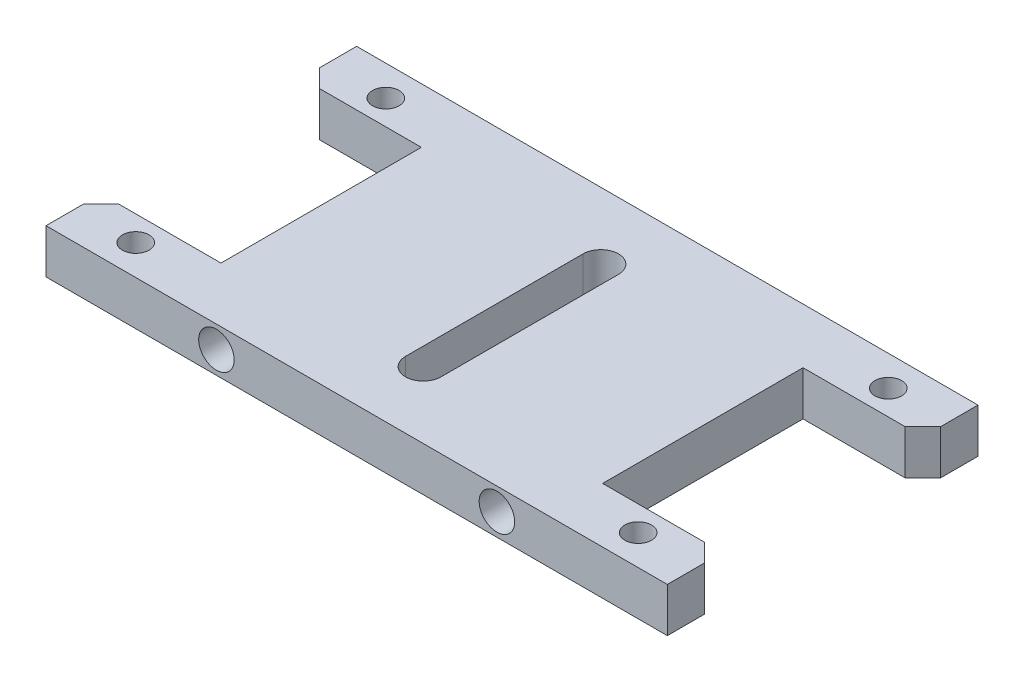
ISO-10303-21;
HEADER;
FILE_DESCRIPTION(('STEP AP214'),'2;1');
FILE_NAME('part.step','',(''),(''),'','','');
FILE_SCHEMA(('AUTOMOTIVE_DESIGN { 1 0 10303 214 1 1 1 1 }'));
ENDSEC;
DATA;
#1=APPLICATION_CONTEXT('core data for automotive mechanical design processes');
#2=APPLICATION_PROTOCOL_DEFINITION('international standard','automotive_design',2000,#1);
#3=PRODUCT_CONTEXT('',#1,'mechanical');
#4=PRODUCT('Part','Part','',(#3));
#5=PRODUCT_RELATED_PRODUCT_CATEGORY('part','',(#4));
#6=PRODUCT_DEFINITION_FORMATION('','',#4);
#7=PRODUCT_DEFINITION_CONTEXT('part definition',#1,'design');
#8=PRODUCT_DEFINITION('design','',#6,#7);
#9=PRODUCT_DEFINITION_SHAPE('','',#8);
#10=(LENGTH_UNIT() NAMED_UNIT(*) SI_UNIT(.MILLI.,.METRE.));
#11=(NAMED_UNIT(*) PLANE_ANGLE_UNIT() SI_UNIT($,.RADIAN.));
#12=(NAMED_UNIT(*) SI_UNIT($,.STERADIAN.) SOLID_ANGLE_UNIT());
#13=UNCERTAINTY_MEASURE_WITH_UNIT(LENGTH_MEASURE(1.E-05),#10,'distance_accuracy_value','');
#14=(GEOMETRIC_REPRESENTATION_CONTEXT(3) GLOBAL_UNCERTAINTY_ASSIGNED_CONTEXT((#13)) GLOBAL_UNIT_ASSIGNED_CONTEXT((#10,
#11,#12)) REPRESENTATION_CONTEXT('',''));
#15=CARTESIAN_POINT('',(0.,0.,0.));
#16=DIRECTION('',(0.,0.,1.));
#17=DIRECTION('',(1.,0.,0.));
#18=AXIS2_PLACEMENT_3D('',#15,#16,#17);
#19=CARTESIAN_POINT('',(0.,5.,-17.5));
#20=DIRECTION('',(0.,0.,-1.));
#21=DIRECTION('',(-1.,0.,0.));
#22=AXIS2_PLACEMENT_3D('',#19,#20,#21);
#23=PLANE('',#22);
#24=DIRECTION('',(1.,0.,0.));
#25=VECTOR('',#24,1.);
#26=CARTESIAN_POINT('',(0.,0.,-17.5));
#27=LINE('',#26,#25);
#28=CARTESIAN_POINT('',(-35.,0.,-17.5));
#29=VERTEX_POINT('',#28);
#30=CARTESIAN_POINT('',(35.,0.,-17.5));
#31=VERTEX_POINT('',#30);
#32=EDGE_CURVE('E264',#29,#31,#27,.T.);
#33=ORIENTED_EDGE('',*,*,#32,.F.);
#34=DIRECTION('',(0.,-1.,0.));
#35=VECTOR('',#34,1.);
#36=CARTESIAN_POINT('',(-35.,5.,-17.5));
#37=LINE('',#36,#35);
#38=CARTESIAN_POINT('',(-35.,5.,-17.5));
#39=VERTEX_POINT('',#38);
#40=EDGE_CURVE('E321',#39,#29,#37,.T.);
#41=ORIENTED_EDGE('',*,*,#40,.F.);
#42=DIRECTION('',(1.,0.,0.));
#43=VECTOR('',#42,1.);
#44=CARTESIAN_POINT('',(0.,5.,-17.5));
#45=LINE('',#44,#43);
#46=CARTESIAN_POINT('',(35.,5.,-17.5));
#47=VERTEX_POINT('',#46);
#48=EDGE_CURVE('E211',#39,#47,#45,.T.);
#49=ORIENTED_EDGE('',*,*,#48,.T.);
#50=DIRECTION('',(0.,-1.,0.));
#51=VECTOR('',#50,1.);
#52=CARTESIAN_POINT('',(35.,5.,-17.5));
#53=LINE('',#52,#51);
#54=EDGE_CURVE('E323',#47,#31,#53,.T.);
#55=ORIENTED_EDGE('',*,*,#54,.T.);
#56=EDGE_LOOP('',(#33,#41,#49,#55));
#57=FACE_BOUND('',#56,.T.);
#58=CARTESIAN_POINT('',(-15.8,2.5,-17.5));
#59=DIRECTION('',(0.,0.,1.));
#60=DIRECTION('',(1.,0.,0.));
#61=AXIS2_PLACEMENT_3D('',#58,#59,#60);
#62=CIRCLE('',#61,2.);
#63=CARTESIAN_POINT('',(-13.8,2.5,-17.5));
#64=VERTEX_POINT('',#63);
#65=EDGE_CURVE('E567',#64,#64,#62,.T.);
#66=ORIENTED_EDGE('',*,*,#65,.T.);
#67=EDGE_LOOP('',(#66));
#68=FACE_BOUND('',#67,.T.);
#69=CARTESIAN_POINT('',(15.8,2.5,-17.5));
#70=DIRECTION('',(0.,0.,-1.));
#71=DIRECTION('',(-1.,0.,0.));
#72=AXIS2_PLACEMENT_3D('',#69,#70,#71);
#73=CIRCLE('',#72,2.);
#74=CARTESIAN_POINT('',(13.8,2.5,-17.5));
#75=VERTEX_POINT('',#74);
#76=EDGE_CURVE('E252',#75,#75,#73,.T.);
#77=ORIENTED_EDGE('',*,*,#76,.F.);
#78=EDGE_LOOP('',(#77));
#79=FACE_BOUND('',#78,.T.);
#80=ADVANCED_FACE('F38',(#57,#68,#79),#23,.T.);
#81=CARTESIAN_POINT('',(0.,5.,17.5));
#82=DIRECTION('',(0.,0.,-1.));
#83=DIRECTION('',(-1.,0.,0.));
#84=AXIS2_PLACEMENT_3D('',#81,#82,#83);
#85=PLANE('',#84);
#86=CARTESIAN_POINT('',(-15.8,2.5,17.5));
#87=DIRECTION('',(0.,0.,1.));
#88=DIRECTION('',(1.,0.,0.));
#89=AXIS2_PLACEMENT_3D('',#86,#87,#88);
#90=CIRCLE('',#89,2.);
#91=CARTESIAN_POINT('',(-13.8,2.5,17.5));
#92=VERTEX_POINT('',#91);
#93=EDGE_CURVE('E563',#92,#92,#90,.T.);
#94=ORIENTED_EDGE('',*,*,#93,.F.);
#95=EDGE_LOOP('',(#94));
#96=FACE_BOUND('',#95,.T.);
#97=DIRECTION('',(1.,0.,0.));
#98=VECTOR('',#97,1.);
#99=CARTESIAN_POINT('',(0.,0.,17.5));
#100=LINE('',#99,#98);
#101=CARTESIAN_POINT('',(-35.,0.,17.5));
#102=VERTEX_POINT('',#101);
#103=CARTESIAN_POINT('',(35.,0.,17.5));
#104=VERTEX_POINT('',#103);
#105=EDGE_CURVE('E280',#102,#104,#100,.T.);
#106=ORIENTED_EDGE('',*,*,#105,.T.);
#107=DIRECTION('',(0.,-1.,0.));
#108=VECTOR('',#107,1.);
#109=CARTESIAN_POINT('',(35.,5.,17.5));
#110=LINE('',#109,#108);
#111=CARTESIAN_POINT('',(35.,5.,17.5));
#112=VERTEX_POINT('',#111);
#113=EDGE_CURVE('E247',#112,#104,#110,.T.);
#114=ORIENTED_EDGE('',*,*,#113,.F.);
#115=DIRECTION('',(1.,0.,0.));
#116=VECTOR('',#115,1.);
#117=CARTESIAN_POINT('',(0.,5.,17.5));
#118=LINE('',#117,#116);
#119=CARTESIAN_POINT('',(-35.,5.,17.5));
#120=VERTEX_POINT('',#119);
#121=EDGE_CURVE('E227',#120,#112,#118,.T.);
#122=ORIENTED_EDGE('',*,*,#121,.F.);
#123=DIRECTION('',(0.,-1.,0.));
#124=VECTOR('',#123,1.);
#125=CARTESIAN_POINT('',(-35.,5.,17.5));
#126=LINE('',#125,#124);
#127=EDGE_CURVE('E313',#120,#102,#126,.T.);
#128=ORIENTED_EDGE('',*,*,#127,.T.);
#129=EDGE_LOOP('',(#106,#114,#122,#128));
#130=FACE_BOUND('',#129,.T.);
#131=CARTESIAN_POINT('',(15.8,2.5,17.5));
#132=DIRECTION('',(0.,0.,-1.));
#133=DIRECTION('',(-1.,0.,0.));
#134=AXIS2_PLACEMENT_3D('',#131,#132,#133);
#135=CIRCLE('',#134,2.);
#136=CARTESIAN_POINT('',(13.8,2.5,17.5));
#137=VERTEX_POINT('',#136);
#138=EDGE_CURVE('E561',#137,#137,#135,.T.);
#139=ORIENTED_EDGE('',*,*,#138,.T.);
#140=EDGE_LOOP('',(#139));
#141=FACE_BOUND('',#140,.T.);
#142=ADVANCED_FACE('F401',(#96,#130,#141),#85,.F.);
#143=CARTESIAN_POINT('',(2.,5.,0.));
#144=DIRECTION('',(1.,0.,0.));
#145=DIRECTION('',(0.,0.,-1.));
#146=AXIS2_PLACEMENT_3D('',#143,#144,#145);
#147=PLANE('',#146);
#148=DIRECTION('',(0.,0.,1.));
#149=VECTOR('',#148,1.);
#150=CARTESIAN_POINT('',(2.,0.,0.));
#151=LINE('',#150,#149);
#152=CARTESIAN_POINT('',(2.,0.,-10.));
#153=VERTEX_POINT('',#152);
#154=CARTESIAN_POINT('',(2.,0.,10.));
#155=VERTEX_POINT('',#154);
#156=EDGE_CURVE('E289',#153,#155,#151,.T.);
#157=ORIENTED_EDGE('',*,*,#156,.T.);
#158=DIRECTION('',(0.,-1.,0.));
#159=VECTOR('',#158,1.);
#160=CARTESIAN_POINT('',(2.,5.,10.));
#161=LINE('',#160,#159);
#162=CARTESIAN_POINT('',(2.,5.,10.));
#163=VERTEX_POINT('',#162);
#164=EDGE_CURVE('E307',#163,#155,#161,.T.);
#165=ORIENTED_EDGE('',*,*,#164,.F.);
#166=DIRECTION('',(0.,0.,1.));
#167=VECTOR('',#166,1.);
#168=CARTESIAN_POINT('',(2.,5.,0.));
#169=LINE('',#168,#167);
#170=CARTESIAN_POINT('',(2.,5.,-10.));
#171=VERTEX_POINT('',#170);
#172=EDGE_CURVE('E236',#171,#163,#169,.T.);
#173=ORIENTED_EDGE('',*,*,#172,.F.);
#174=DIRECTION('',(0.,-1.,0.));
#175=VECTOR('',#174,1.);
#176=CARTESIAN_POINT('',(2.,5.,-10.));
#177=LINE('',#176,#175);
#178=EDGE_CURVE('E188',#171,#153,#177,.T.);
#179=ORIENTED_EDGE('',*,*,#178,.T.);
#180=EDGE_LOOP('',(#157,#165,#173,#179));
#181=FACE_BOUND('',#180,.T.);
#182=ADVANCED_FACE('F406',(#181),#147,.F.);
#183=CARTESIAN_POINT('',(0.,5.,10.));
#184=DIRECTION('',(0.,-1.,0.));
#185=DIRECTION('',(0.,0.,-1.));
#186=AXIS2_PLACEMENT_3D('',#183,#184,#185);
#187=CYLINDRICAL_SURFACE('',#186,2.);
#188=CARTESIAN_POINT('',(0.,0.,10.));
#189=DIRECTION('',(0.,1.,0.));
#190=DIRECTION('',(0.,0.,1.));
#191=AXIS2_PLACEMENT_3D('',#188,#189,#190);
#192=CIRCLE('',#191,2.);
#193=CARTESIAN_POINT('',(-2.,0.,10.));
#194=VERTEX_POINT('',#193);
#195=EDGE_CURVE('E292',#155,#194,#192,.F.);
#196=ORIENTED_EDGE('',*,*,#195,.T.);
#197=DIRECTION('',(0.,-1.,0.));
#198=VECTOR('',#197,1.);
#199=CARTESIAN_POINT('',(-2.,5.,10.));
#200=LINE('',#199,#198);
#201=CARTESIAN_POINT('',(-2.,5.,10.));
#202=VERTEX_POINT('',#201);
#203=EDGE_CURVE('E305',#202,#194,#200,.T.);
#204=ORIENTED_EDGE('',*,*,#203,.F.);
#205=CARTESIAN_POINT('',(0.,5.,10.));
#206=DIRECTION('',(0.,1.,0.));
#207=DIRECTION('',(0.,0.,1.));
#208=AXIS2_PLACEMENT_3D('',#205,#206,#207);
#209=CIRCLE('',#208,2.);
#210=EDGE_CURVE('E239',#163,#202,#209,.F.);
#211=ORIENTED_EDGE('',*,*,#210,.F.);
#212=ORIENTED_EDGE('',*,*,#164,.T.);
#213=EDGE_LOOP('',(#196,#204,#211,#212));
#214=FACE_BOUND('',#213,.T.);
#215=ADVANCED_FACE('F462',(#214),#187,.F.);
#216=CARTESIAN_POINT('',(-2.,5.,0.));
#217=DIRECTION('',(1.,0.,0.));
#218=DIRECTION('',(0.,0.,-1.));
#219=AXIS2_PLACEMENT_3D('',#216,#217,#218);
#220=PLANE('',#219);
#221=DIRECTION('',(0.,0.,1.));
#222=VECTOR('',#221,1.);
#223=CARTESIAN_POINT('',(-2.,0.,0.));
#224=LINE('',#223,#222);
#225=CARTESIAN_POINT('',(-2.,0.,-10.));
#226=VERTEX_POINT('',#225);
#227=EDGE_CURVE('E295',#226,#194,#224,.T.);
#228=ORIENTED_EDGE('',*,*,#227,.F.);
#229=DIRECTION('',(0.,-1.,0.));
#230=VECTOR('',#229,1.);
#231=CARTESIAN_POINT('',(-2.,5.,-10.));
#232=LINE('',#231,#230);
#233=CARTESIAN_POINT('',(-2.,5.,-10.));
#234=VERTEX_POINT('',#233);
#235=EDGE_CURVE('E303',#234,#226,#232,.T.);
#236=ORIENTED_EDGE('',*,*,#235,.F.);
#237=DIRECTION('',(0.,0.,1.));
#238=VECTOR('',#237,1.);
#239=CARTESIAN_POINT('',(-2.,5.,0.));
#240=LINE('',#239,#238);
#241=EDGE_CURVE('E241',#234,#202,#240,.T.);
#242=ORIENTED_EDGE('',*,*,#241,.T.);
#243=ORIENTED_EDGE('',*,*,#203,.T.);
#244=EDGE_LOOP('',(#228,#236,#242,#243));
#245=FACE_BOUND('',#244,.T.);
#246=ADVANCED_FACE('F418',(#245),#220,.T.);
#247=CARTESIAN_POINT('',(0.,5.,11.2885966736073));
#248=DIRECTION('',(0.,0.,-1.));
#249=DIRECTION('',(-1.,0.,0.));
#250=AXIS2_PLACEMENT_3D('',#247,#248,#249);
#251=PLANE('',#250);
#252=DIRECTION('',(1.,0.,0.));
#253=VECTOR('',#252,1.);
#254=CARTESIAN_POINT('',(0.,5.,11.2885966736073));
#255=LINE('',#254,#253);
#256=CARTESIAN_POINT('',(21.499999989902,5.,11.2885966736073));
#257=VERTEX_POINT('',#256);
#258=CARTESIAN_POINT('',(33.,5.,11.2885966736073));
#259=VERTEX_POINT('',#258);
#260=EDGE_CURVE('E180',#257,#259,#255,.T.);
#261=ORIENTED_EDGE('',*,*,#260,.T.);
#262=DIRECTION('',(0.,-1.,0.));
#263=VECTOR('',#262,1.);
#264=CARTESIAN_POINT('',(33.,5.,11.2885966736073));
#265=LINE('',#264,#263);
#266=CARTESIAN_POINT('',(33.,0.,11.2885966736073));
#267=VERTEX_POINT('',#266);
#268=EDGE_CURVE('E310',#259,#267,#265,.T.);
#269=ORIENTED_EDGE('',*,*,#268,.T.);
#270=DIRECTION('',(1.,0.,0.));
#271=VECTOR('',#270,1.);
#272=CARTESIAN_POINT('',(0.,0.,11.2885966736073));
#273=LINE('',#272,#271);
#274=CARTESIAN_POINT('',(21.499999989902,0.,11.2885966736073));
#275=VERTEX_POINT('',#274);
#276=EDGE_CURVE('E183',#275,#267,#273,.T.);
#277=ORIENTED_EDGE('',*,*,#276,.F.);
#278=DIRECTION('',(0.,-1.,0.));
#279=VECTOR('',#278,1.);
#280=CARTESIAN_POINT('',(21.499999989902,5.,11.2885966736073));
#281=LINE('',#280,#279);
#282=EDGE_CURVE('E176',#257,#275,#281,.T.);
#283=ORIENTED_EDGE('',*,*,#282,.F.);
#284=EDGE_LOOP('',(#261,#269,#277,#283));
#285=FACE_BOUND('',#284,.T.);
#286=ADVANCED_FACE('F178',(#285),#251,.T.);
#287=CARTESIAN_POINT('',(21.499999989902,5.,0.));
#288=DIRECTION('',(1.,0.,0.));
#289=DIRECTION('',(0.,0.,-1.));
#290=AXIS2_PLACEMENT_3D('',#287,#288,#289);
#291=PLANE('',#290);
#292=DIRECTION('',(0.,0.,1.));
#293=VECTOR('',#292,1.);
#294=CARTESIAN_POINT('',(21.499999989902,0.,0.));
#295=LINE('',#294,#293);
#296=CARTESIAN_POINT('',(21.499999989902,0.,-11.2885966736073));
#297=VERTEX_POINT('',#296);
#298=EDGE_CURVE('E256',#297,#275,#295,.T.);
#299=ORIENTED_EDGE('',*,*,#298,.F.);
#300=DIRECTION('',(0.,-1.,0.));
#301=VECTOR('',#300,1.);
#302=CARTESIAN_POINT('',(21.499999989902,5.,-11.2885966736073));
#303=LINE('',#302,#301);
#304=CARTESIAN_POINT('',(21.499999989902,5.,-11.2885966736073));
#305=VERTEX_POINT('',#304);
#306=EDGE_CURVE('E189',#305,#297,#303,.T.);
#307=ORIENTED_EDGE('',*,*,#306,.F.);
#308=DIRECTION('',(0.,0.,1.));
#309=VECTOR('',#308,1.);
#310=CARTESIAN_POINT('',(21.499999989902,5.,0.));
#311=LINE('',#310,#309);
#312=EDGE_CURVE('E196',#305,#257,#311,.T.);
#313=ORIENTED_EDGE('',*,*,#312,.T.);
#314=ORIENTED_EDGE('',*,*,#282,.T.);
#315=EDGE_LOOP('',(#299,#307,#313,#314));
#316=FACE_BOUND('',#315,.T.);
#317=ADVANCED_FACE('F201',(#316),#291,.T.);
#318=CARTESIAN_POINT('',(0.,5.,-11.2885966736073));
#319=DIRECTION('',(0.,0.,-1.));
#320=DIRECTION('',(-1.,0.,0.));
#321=AXIS2_PLACEMENT_3D('',#318,#319,#320);
#322=PLANE('',#321);
#323=DIRECTION('',(1.,0.,0.));
#324=VECTOR('',#323,1.);
#325=CARTESIAN_POINT('',(0.,0.,-11.2885966736073));
#326=LINE('',#325,#324);
#327=CARTESIAN_POINT('',(33.,0.,-11.2885966736073));
#328=VERTEX_POINT('',#327);
#329=EDGE_CURVE('E258',#297,#328,#326,.T.);
#330=ORIENTED_EDGE('',*,*,#329,.T.);
#331=DIRECTION('',(0.,1.,0.));
#332=VECTOR('',#331,1.);
#333=CARTESIAN_POINT('',(33.,5.,-11.2885966736073));
#334=LINE('',#333,#332);
#335=CARTESIAN_POINT('',(33.,5.,-11.2885966736073));
#336=VERTEX_POINT('',#335);
#337=EDGE_CURVE('E346',#328,#336,#334,.T.);
#338=ORIENTED_EDGE('',*,*,#337,.T.);
#339=DIRECTION('',(1.,0.,0.));
#340=VECTOR('',#339,1.);
#341=CARTESIAN_POINT('',(0.,5.,-11.2885966736073));
#342=LINE('',#341,#340);
#343=EDGE_CURVE('E203',#305,#336,#342,.T.);
#344=ORIENTED_EDGE('',*,*,#343,.F.);
#345=ORIENTED_EDGE('',*,*,#306,.T.);
#346=EDGE_LOOP('',(#330,#338,#344,#345));
#347=FACE_BOUND('',#346,.T.);
#348=ADVANCED_FACE('F385',(#347),#322,.F.);
#349=CARTESIAN_POINT('',(35.,5.,0.));
#350=DIRECTION('',(1.,0.,0.));
#351=DIRECTION('',(0.,0.,-1.));
#352=AXIS2_PLACEMENT_3D('',#349,#350,#351);
#353=PLANE('',#352);
#354=DIRECTION('',(0.,0.,1.));
#355=VECTOR('',#354,1.);
#356=CARTESIAN_POINT('',(35.,5.,0.));
#357=LINE('',#356,#355);
#358=CARTESIAN_POINT('',(35.,5.,-13.2885966736073));
#359=VERTEX_POINT('',#358);
#360=EDGE_CURVE('E205',#47,#359,#357,.T.);
#361=ORIENTED_EDGE('',*,*,#360,.T.);
#362=DIRECTION('',(0.,-1.,0.));
#363=VECTOR('',#362,1.);
#364=CARTESIAN_POINT('',(35.,0.,-13.2885966736073));
#365=LINE('',#364,#363);
#366=CARTESIAN_POINT('',(35.,0.,-13.2885966736073));
#367=VERTEX_POINT('',#366);
#368=EDGE_CURVE('E343',#359,#367,#365,.T.);
#369=ORIENTED_EDGE('',*,*,#368,.T.);
#370=DIRECTION('',(0.,0.,1.));
#371=VECTOR('',#370,1.);
#372=CARTESIAN_POINT('',(35.,0.,0.));
#373=LINE('',#372,#371);
#374=EDGE_CURVE('E261',#31,#367,#373,.T.);
#375=ORIENTED_EDGE('',*,*,#374,.F.);
#376=ORIENTED_EDGE('',*,*,#54,.F.);
#377=EDGE_LOOP('',(#361,#369,#375,#376));
#378=FACE_BOUND('',#377,.T.);
#379=ADVANCED_FACE('F379',(#378),#353,.T.);
#380=CARTESIAN_POINT('',(-35.,5.,0.));
#381=DIRECTION('',(1.,0.,0.));
#382=DIRECTION('',(0.,0.,-1.));
#383=AXIS2_PLACEMENT_3D('',#380,#381,#382);
#384=PLANE('',#383);
#385=DIRECTION('',(0.,0.,1.));
#386=VECTOR('',#385,1.);
#387=CARTESIAN_POINT('',(-35.,0.,0.));
#388=LINE('',#387,#386);
#389=CARTESIAN_POINT('',(-35.,0.,-13.2885966736073));
#390=VERTEX_POINT('',#389);
#391=EDGE_CURVE('E268',#29,#390,#388,.T.);
#392=ORIENTED_EDGE('',*,*,#391,.T.);
#393=DIRECTION('',(0.,1.,0.));
#394=VECTOR('',#393,1.);
#395=CARTESIAN_POINT('',(-35.,5.,-13.2885966736073));
#396=LINE('',#395,#394);
#397=CARTESIAN_POINT('',(-35.,5.,-13.2885966736073));
#398=VERTEX_POINT('',#397);
#399=EDGE_CURVE('E11',#390,#398,#396,.T.);
#400=ORIENTED_EDGE('',*,*,#399,.T.);
#401=DIRECTION('',(0.,0.,1.));
#402=VECTOR('',#401,1.);
#403=CARTESIAN_POINT('',(-35.,5.,0.));
#404=LINE('',#403,#402);
#405=EDGE_CURVE('E215',#39,#398,#404,.T.);
#406=ORIENTED_EDGE('',*,*,#405,.F.);
#407=ORIENTED_EDGE('',*,*,#40,.T.);
#408=EDGE_LOOP('',(#392,#400,#406,#407));
#409=FACE_BOUND('',#408,.T.);
#410=ADVANCED_FACE('F372',(#409),#384,.F.);
#411=CARTESIAN_POINT('',(0.,5.,-11.2885966736073));
#412=DIRECTION('',(0.,0.,1.));
#413=DIRECTION('',(1.,0.,0.));
#414=AXIS2_PLACEMENT_3D('',#411,#412,#413);
#415=PLANE('',#414);
#416=DIRECTION('',(-1.,0.,0.));
#417=VECTOR('',#416,1.);
#418=CARTESIAN_POINT('',(0.,5.,-11.2885966736073));
#419=LINE('',#418,#417);
#420=CARTESIAN_POINT('',(-21.499999989902,5.,-11.2885966736073));
#421=VERTEX_POINT('',#420);
#422=CARTESIAN_POINT('',(-33.,5.,-11.2885966736073));
#423=VERTEX_POINT('',#422);
#424=EDGE_CURVE('E218',#421,#423,#419,.T.);
#425=ORIENTED_EDGE('',*,*,#424,.T.);
#426=DIRECTION('',(0.,-1.,0.));
#427=VECTOR('',#426,1.);
#428=CARTESIAN_POINT('',(-33.,0.,-11.2885966736073));
#429=LINE('',#428,#427);
#430=CARTESIAN_POINT('',(-33.,0.,-11.2885966736073));
#431=VERTEX_POINT('',#430);
#432=EDGE_CURVE('E47',#423,#431,#429,.T.);
#433=ORIENTED_EDGE('',*,*,#432,.T.);
#434=DIRECTION('',(-1.,0.,0.));
#435=VECTOR('',#434,1.);
#436=CARTESIAN_POINT('',(0.,0.,-11.2885966736073));
#437=LINE('',#436,#435);
#438=CARTESIAN_POINT('',(-21.499999989902,0.,-11.2885966736073));
#439=VERTEX_POINT('',#438);
#440=EDGE_CURVE('E271',#439,#431,#437,.T.);
#441=ORIENTED_EDGE('',*,*,#440,.F.);
#442=DIRECTION('',(0.,-1.,0.));
#443=VECTOR('',#442,1.);
#444=CARTESIAN_POINT('',(-21.499999989902,5.,-11.2885966736073));
#445=LINE('',#444,#443);
#446=EDGE_CURVE('E319',#421,#439,#445,.T.);
#447=ORIENTED_EDGE('',*,*,#446,.F.);
#448=EDGE_LOOP('',(#425,#433,#441,#447));
#449=FACE_BOUND('',#448,.T.);
#450=ADVANCED_FACE('F355',(#449),#415,.T.);
#451=CARTESIAN_POINT('',(-21.499999989902,5.,0.));
#452=DIRECTION('',(1.,0.,0.));
#453=DIRECTION('',(0.,0.,-1.));
#454=AXIS2_PLACEMENT_3D('',#451,#452,#453);
#455=PLANE('',#454);
#456=DIRECTION('',(0.,0.,1.));
#457=VECTOR('',#456,1.);
#458=CARTESIAN_POINT('',(-21.499999989902,0.,0.));
#459=LINE('',#458,#457);
#460=CARTESIAN_POINT('',(-21.499999989902,0.,11.2885966736073));
#461=VERTEX_POINT('',#460);
#462=EDGE_CURVE('E275',#439,#461,#459,.T.);
#463=ORIENTED_EDGE('',*,*,#462,.T.);
#464=DIRECTION('',(0.,-1.,0.));
#465=VECTOR('',#464,1.);
#466=CARTESIAN_POINT('',(-21.499999989902,5.,11.2885966736073));
#467=LINE('',#466,#465);
#468=CARTESIAN_POINT('',(-21.499999989902,5.,11.2885966736073));
#469=VERTEX_POINT('',#468);
#470=EDGE_CURVE('E316',#469,#461,#467,.T.);
#471=ORIENTED_EDGE('',*,*,#470,.F.);
#472=DIRECTION('',(0.,0.,1.));
#473=VECTOR('',#472,1.);
#474=CARTESIAN_POINT('',(-21.499999989902,5.,0.));
#475=LINE('',#474,#473);
#476=EDGE_CURVE('E222',#421,#469,#475,.T.);
#477=ORIENTED_EDGE('',*,*,#476,.F.);
#478=ORIENTED_EDGE('',*,*,#446,.T.);
#479=EDGE_LOOP('',(#463,#471,#477,#478));
#480=FACE_BOUND('',#479,.T.);
#481=ADVANCED_FACE('F366',(#480),#455,.F.);
#482=CARTESIAN_POINT('',(0.,5.,11.2885966736073));
#483=DIRECTION('',(0.,0.,1.));
#484=DIRECTION('',(1.,0.,0.));
#485=AXIS2_PLACEMENT_3D('',#482,#483,#484);
#486=PLANE('',#485);
#487=DIRECTION('',(-1.,0.,0.));
#488=VECTOR('',#487,1.);
#489=CARTESIAN_POINT('',(0.,0.,11.2885966736073));
#490=LINE('',#489,#488);
#491=CARTESIAN_POINT('',(-33.,0.,11.2885966736073));
#492=VERTEX_POINT('',#491);
#493=EDGE_CURVE('E278',#461,#492,#490,.T.);
#494=ORIENTED_EDGE('',*,*,#493,.T.);
#495=DIRECTION('',(0.,1.,0.));
#496=VECTOR('',#495,1.);
#497=CARTESIAN_POINT('',(-33.,5.,11.2885966736073));
#498=LINE('',#497,#496);
#499=CARTESIAN_POINT('',(-33.,5.,11.2885966736073));
#500=VERTEX_POINT('',#499);
#501=EDGE_CURVE('E62',#492,#500,#498,.T.);
#502=ORIENTED_EDGE('',*,*,#501,.T.);
#503=DIRECTION('',(-1.,0.,0.));
#504=VECTOR('',#503,1.);
#505=CARTESIAN_POINT('',(0.,5.,11.2885966736073));
#506=LINE('',#505,#504);
#507=EDGE_CURVE('E225',#469,#500,#506,.T.);
#508=ORIENTED_EDGE('',*,*,#507,.F.);
#509=ORIENTED_EDGE('',*,*,#470,.T.);
#510=EDGE_LOOP('',(#494,#502,#508,#509));
#511=FACE_BOUND('',#510,.T.);
#512=ADVANCED_FACE('F484',(#511),#486,.F.);
#513=CARTESIAN_POINT('',(-35.,5.,13.2885966736073));
#514=VERTEX_POINT('',#513);
#515=EDGE_CURVE('E219',#514,#120,#404,.T.);
#516=ORIENTED_EDGE('',*,*,#515,.F.);
#517=DIRECTION('',(0.,-1.,0.));
#518=VECTOR('',#517,1.);
#519=CARTESIAN_POINT('',(-35.,5.,13.2885966736073));
#520=LINE('',#519,#518);
#521=CARTESIAN_POINT('',(-35.,0.,13.2885966736073));
#522=VERTEX_POINT('',#521);
#523=EDGE_CURVE('E348',#514,#522,#520,.T.);
#524=ORIENTED_EDGE('',*,*,#523,.T.);
#525=EDGE_CURVE('E272',#522,#102,#388,.T.);
#526=ORIENTED_EDGE('',*,*,#525,.T.);
#527=ORIENTED_EDGE('',*,*,#127,.F.);
#528=EDGE_LOOP('',(#516,#524,#526,#527));
#529=FACE_BOUND('',#528,.T.);
#530=ADVANCED_FACE('F474',(#529),#384,.F.);
#531=CARTESIAN_POINT('',(28.3037275007649,5.,-14.0885966736073));
#532=DIRECTION('',(0.,-1.,0.));
#533=DIRECTION('',(0.,0.,-1.));
#534=AXIS2_PLACEMENT_3D('',#531,#532,#533);
#535=CYLINDRICAL_SURFACE('',#534,1.5);
#536=CARTESIAN_POINT('',(28.3037275007649,5.,-14.0885966736073));
#537=DIRECTION('',(0.,1.,0.));
#538=DIRECTION('',(0.,0.,1.));
#539=AXIS2_PLACEMENT_3D('',#536,#537,#538);
#540=CIRCLE('',#539,1.5);
#541=CARTESIAN_POINT('',(28.3037275007649,5.,-12.5885966736073));
#542=VERTEX_POINT('',#541);
#543=EDGE_CURVE('E233',#542,#542,#540,.F.);
#544=ORIENTED_EDGE('',*,*,#543,.F.);
#545=EDGE_LOOP('',(#544));
#546=FACE_BOUND('',#545,.T.);
#547=CARTESIAN_POINT('',(28.3037275007649,0.,-14.0885966736073));
#548=DIRECTION('',(0.,1.,0.));
#549=DIRECTION('',(0.,0.,1.));
#550=AXIS2_PLACEMENT_3D('',#547,#548,#549);
#551=CIRCLE('',#550,1.5);
#552=CARTESIAN_POINT('',(28.3037275007649,0.,-12.5885966736073));
#553=VERTEX_POINT('',#552);
#554=EDGE_CURVE('E286',#553,#553,#551,.F.);
#555=ORIENTED_EDGE('',*,*,#554,.T.);
#556=EDGE_LOOP('',(#555));
#557=FACE_BOUND('',#556,.T.);
#558=ADVANCED_FACE('F470',(#546,#557),#535,.F.);
#559=CARTESIAN_POINT('',(28.3037275007649,5.,14.0885966736073));
#560=DIRECTION('',(0.,-1.,0.));
#561=DIRECTION('',(0.,0.,-1.));
#562=AXIS2_PLACEMENT_3D('',#559,#560,#561);
#563=CYLINDRICAL_SURFACE('',#562,1.5);
#564=CARTESIAN_POINT('',(28.3037275007649,5.,14.0885966736073));
#565=DIRECTION('',(0.,1.,0.));
#566=DIRECTION('',(0.,0.,1.));
#567=AXIS2_PLACEMENT_3D('',#564,#565,#566);
#568=CIRCLE('',#567,1.5);
#569=CARTESIAN_POINT('',(28.3037275007649,5.,15.5885966736073));
#570=VERTEX_POINT('',#569);
#571=EDGE_CURVE('E230',#570,#570,#568,.T.);
#572=ORIENTED_EDGE('',*,*,#571,.T.);
#573=EDGE_LOOP('',(#572));
#574=FACE_BOUND('',#573,.T.);
#575=CARTESIAN_POINT('',(28.3037275007649,0.,14.0885966736073));
#576=DIRECTION('',(0.,1.,0.));
#577=DIRECTION('',(0.,0.,1.));
#578=AXIS2_PLACEMENT_3D('',#575,#576,#577);
#579=CIRCLE('',#578,1.5);
#580=CARTESIAN_POINT('',(28.3037275007649,0.,15.5885966736073));
#581=VERTEX_POINT('',#580);
#582=EDGE_CURVE('E283',#581,#581,#579,.T.);
#583=ORIENTED_EDGE('',*,*,#582,.F.);
#584=EDGE_LOOP('',(#583));
#585=FACE_BOUND('',#584,.T.);
#586=ADVANCED_FACE('F473',(#574,#585),#563,.F.);
#587=CARTESIAN_POINT('',(35.,0.,13.2885966736073));
#588=VERTEX_POINT('',#587);
#589=EDGE_CURVE('E265',#588,#104,#373,.T.);
#590=ORIENTED_EDGE('',*,*,#589,.F.);
#591=DIRECTION('',(0.,1.,0.));
#592=VECTOR('',#591,1.);
#593=CARTESIAN_POINT('',(35.,5.,13.2885966736073));
#594=LINE('',#593,#592);
#595=CARTESIAN_POINT('',(35.,5.,13.2885966736073));
#596=VERTEX_POINT('',#595);
#597=EDGE_CURVE('E335',#588,#596,#594,.T.);
#598=ORIENTED_EDGE('',*,*,#597,.T.);
#599=EDGE_CURVE('E212',#596,#112,#357,.T.);
#600=ORIENTED_EDGE('',*,*,#599,.T.);
#601=ORIENTED_EDGE('',*,*,#113,.T.);
#602=EDGE_LOOP('',(#590,#598,#600,#601));
#603=FACE_BOUND('',#602,.T.);
#604=ADVANCED_FACE('F423',(#603),#353,.T.);
#605=CARTESIAN_POINT('',(-28.3037275007649,5.,-14.0885966736073));
#606=DIRECTION('',(0.,-1.,0.));
#607=DIRECTION('',(0.,0.,-1.));
#608=AXIS2_PLACEMENT_3D('',#605,#606,#607);
#609=CYLINDRICAL_SURFACE('',#608,1.5);
#610=CARTESIAN_POINT('',(-28.3037275007649,5.,-14.0885966736073));
#611=DIRECTION('',(0.,1.,0.));
#612=DIRECTION('',(0.,0.,1.));
#613=AXIS2_PLACEMENT_3D('',#610,#611,#612);
#614=CIRCLE('',#613,1.5);
#615=CARTESIAN_POINT('',(-28.3037275007649,5.,-12.5885966736073));
#616=VERTEX_POINT('',#615);
#617=EDGE_CURVE('E199',#616,#616,#614,.T.);
#618=ORIENTED_EDGE('',*,*,#617,.T.);
#619=EDGE_LOOP('',(#618));
#620=FACE_BOUND('',#619,.T.);
#621=CARTESIAN_POINT('',(-28.3037275007649,0.,-14.0885966736073));
#622=DIRECTION('',(0.,1.,0.));
#623=DIRECTION('',(0.,0.,1.));
#624=AXIS2_PLACEMENT_3D('',#621,#622,#623);
#625=CIRCLE('',#624,1.5);
#626=CARTESIAN_POINT('',(-28.3037275007649,0.,-12.5885966736073));
#627=VERTEX_POINT('',#626);
#628=EDGE_CURVE('E251',#627,#627,#625,.T.);
#629=ORIENTED_EDGE('',*,*,#628,.F.);
#630=EDGE_LOOP('',(#629));
#631=FACE_BOUND('',#630,.T.);
#632=ADVANCED_FACE('F419',(#620,#631),#609,.F.);
#633=CARTESIAN_POINT('',(-28.3037275007649,5.,14.0885966736073));
#634=DIRECTION('',(0.,-1.,0.));
#635=DIRECTION('',(0.,0.,-1.));
#636=AXIS2_PLACEMENT_3D('',#633,#634,#635);
#637=CYLINDRICAL_SURFACE('',#636,1.5);
#638=CARTESIAN_POINT('',(-28.3037275007649,5.,14.0885966736073));
#639=DIRECTION('',(0.,1.,0.));
#640=DIRECTION('',(0.,0.,1.));
#641=AXIS2_PLACEMENT_3D('',#638,#639,#640);
#642=CIRCLE('',#641,1.5);
#643=CARTESIAN_POINT('',(-28.3037275007649,5.,15.5885966736073));
#644=VERTEX_POINT('',#643);
#645=EDGE_CURVE('E301',#644,#644,#642,.F.);
#646=ORIENTED_EDGE('',*,*,#645,.F.);
#647=EDGE_LOOP('',(#646));
#648=FACE_BOUND('',#647,.T.);
#649=CARTESIAN_POINT('',(-28.3037275007649,0.,14.0885966736073));
#650=DIRECTION('',(0.,1.,0.));
#651=DIRECTION('',(0.,0.,1.));
#652=AXIS2_PLACEMENT_3D('',#649,#650,#651);
#653=CIRCLE('',#652,1.5);
#654=CARTESIAN_POINT('',(-28.3037275007649,0.,15.5885966736073));
#655=VERTEX_POINT('',#654);
#656=EDGE_CURVE('E248',#655,#655,#653,.F.);
#657=ORIENTED_EDGE('',*,*,#656,.T.);
#658=EDGE_LOOP('',(#657));
#659=FACE_BOUND('',#658,.T.);
#660=ADVANCED_FACE('F422',(#648,#659),#637,.F.);
#661=CARTESIAN_POINT('',(0.,5.,-10.));
#662=DIRECTION('',(0.,-1.,0.));
#663=DIRECTION('',(0.,0.,-1.));
#664=AXIS2_PLACEMENT_3D('',#661,#662,#663);
#665=CYLINDRICAL_SURFACE('',#664,2.);
#666=CARTESIAN_POINT('',(0.,0.,-10.));
#667=DIRECTION('',(0.,1.,0.));
#668=DIRECTION('',(0.,0.,1.));
#669=AXIS2_PLACEMENT_3D('',#666,#667,#668);
#670=CIRCLE('',#669,2.);
#671=EDGE_CURVE('E298',#153,#226,#670,.T.);
#672=ORIENTED_EDGE('',*,*,#671,.F.);
#673=ORIENTED_EDGE('',*,*,#178,.F.);
#674=CARTESIAN_POINT('',(0.,5.,-10.));
#675=DIRECTION('',(0.,1.,0.));
#676=DIRECTION('',(0.,0.,1.));
#677=AXIS2_PLACEMENT_3D('',#674,#675,#676);
#678=CIRCLE('',#677,2.);
#679=EDGE_CURVE('E244',#171,#234,#678,.T.);
#680=ORIENTED_EDGE('',*,*,#679,.T.);
#681=ORIENTED_EDGE('',*,*,#235,.T.);
#682=EDGE_LOOP('',(#672,#673,#680,#681));
#683=FACE_BOUND('',#682,.T.);
#684=ADVANCED_FACE('F426',(#683),#665,.F.);
#685=CARTESIAN_POINT('',(0.,5.,0.));
#686=DIRECTION('',(0.,1.,0.));
#687=DIRECTION('',(0.,0.,1.));
#688=AXIS2_PLACEMENT_3D('',#685,#686,#687);
#689=PLANE('',#688);
#690=ORIENTED_EDGE('',*,*,#645,.T.);
#691=EDGE_LOOP('',(#690));
#692=FACE_BOUND('',#691,.T.);
#693=ORIENTED_EDGE('',*,*,#617,.F.);
#694=EDGE_LOOP('',(#693));
#695=FACE_BOUND('',#694,.T.);
#696=ORIENTED_EDGE('',*,*,#599,.F.);
#697=DIRECTION('',(0.707106781186545,0.,0.70710678118655));
#698=VECTOR('',#697,1.);
#699=CARTESIAN_POINT('',(10.8557016631965,5.,-10.8557016631964));
#700=LINE('',#699,#698);
#701=EDGE_CURVE('E198',#596,#259,#700,.F.);
#702=ORIENTED_EDGE('',*,*,#701,.T.);
#703=ORIENTED_EDGE('',*,*,#260,.F.);
#704=ORIENTED_EDGE('',*,*,#312,.F.);
#705=ORIENTED_EDGE('',*,*,#343,.T.);
#706=DIRECTION('',(0.707106781186549,0.,-0.707106781186546));
#707=VECTOR('',#706,1.);
#708=CARTESIAN_POINT('',(10.8557016631963,5.,10.8557016631963));
#709=LINE('',#708,#707);
#710=EDGE_CURVE('E340',#336,#359,#709,.T.);
#711=ORIENTED_EDGE('',*,*,#710,.T.);
#712=ORIENTED_EDGE('',*,*,#360,.F.);
#713=ORIENTED_EDGE('',*,*,#48,.F.);
#714=ORIENTED_EDGE('',*,*,#405,.T.);
#715=DIRECTION('',(0.707106781186545,0.,0.70710678118655));
#716=VECTOR('',#715,1.);
#717=CARTESIAN_POINT('',(-10.8557016631965,5.,10.8557016631964));
#718=LINE('',#717,#716);
#719=EDGE_CURVE('E337',#398,#423,#718,.T.);
#720=ORIENTED_EDGE('',*,*,#719,.T.);
#721=ORIENTED_EDGE('',*,*,#424,.F.);
#722=ORIENTED_EDGE('',*,*,#476,.T.);
#723=ORIENTED_EDGE('',*,*,#507,.T.);
#724=DIRECTION('',(0.707106781186549,0.,-0.707106781186546));
#725=VECTOR('',#724,1.);
#726=CARTESIAN_POINT('',(-10.8557016631963,5.,-10.8557016631963));
#727=LINE('',#726,#725);
#728=EDGE_CURVE('E54',#500,#514,#727,.F.);
#729=ORIENTED_EDGE('',*,*,#728,.T.);
#730=ORIENTED_EDGE('',*,*,#515,.T.);
#731=ORIENTED_EDGE('',*,*,#121,.T.);
#732=EDGE_LOOP('',(#696,#702,#703,#704,#705,#711,#712,#713,#714,#720,#721,#722,#723,#729,#730,#731));
#733=FACE_BOUND('',#732,.T.);
#734=ORIENTED_EDGE('',*,*,#571,.F.);
#735=EDGE_LOOP('',(#734));
#736=FACE_BOUND('',#735,.T.);
#737=ORIENTED_EDGE('',*,*,#543,.T.);
#738=EDGE_LOOP('',(#737));
#739=FACE_BOUND('',#738,.T.);
#740=ORIENTED_EDGE('',*,*,#172,.T.);
#741=ORIENTED_EDGE('',*,*,#210,.T.);
#742=ORIENTED_EDGE('',*,*,#241,.F.);
#743=ORIENTED_EDGE('',*,*,#679,.F.);
#744=EDGE_LOOP('',(#740,#741,#742,#743));
#745=FACE_BOUND('',#744,.T.);
#746=ADVANCED_FACE('F193',(#692,#695,#733,#736,#739,#745),#689,.T.);
#747=CARTESIAN_POINT('',(0.,0.,0.));
#748=DIRECTION('',(0.,1.,0.));
#749=DIRECTION('',(0.,0.,1.));
#750=AXIS2_PLACEMENT_3D('',#747,#748,#749);
#751=PLANE('',#750);
#752=ORIENTED_EDGE('',*,*,#656,.F.);
#753=EDGE_LOOP('',(#752));
#754=FACE_BOUND('',#753,.T.);
#755=ORIENTED_EDGE('',*,*,#628,.T.);
#756=EDGE_LOOP('',(#755));
#757=FACE_BOUND('',#756,.T.);
#758=ORIENTED_EDGE('',*,*,#276,.T.);
#759=DIRECTION('',(-0.707106781186545,0.,-0.70710678118655));
#760=VECTOR('',#759,1.);
#761=CARTESIAN_POINT('',(33.,0.,11.2885966736073));
#762=LINE('',#761,#760);
#763=EDGE_CURVE('E333',#267,#588,#762,.F.);
#764=ORIENTED_EDGE('',*,*,#763,.T.);
#765=ORIENTED_EDGE('',*,*,#589,.T.);
#766=ORIENTED_EDGE('',*,*,#105,.F.);
#767=ORIENTED_EDGE('',*,*,#525,.F.);
#768=DIRECTION('',(-0.707106781186549,0.,0.707106781186546));
#769=VECTOR('',#768,1.);
#770=CARTESIAN_POINT('',(-35.,0.,13.2885966736073));
#771=LINE('',#770,#769);
#772=EDGE_CURVE('E329',#522,#492,#771,.F.);
#773=ORIENTED_EDGE('',*,*,#772,.T.);
#774=ORIENTED_EDGE('',*,*,#493,.F.);
#775=ORIENTED_EDGE('',*,*,#462,.F.);
#776=ORIENTED_EDGE('',*,*,#440,.T.);
#777=DIRECTION('',(-0.707106781186545,0.,-0.70710678118655));
#778=VECTOR('',#777,1.);
#779=CARTESIAN_POINT('',(-33.,0.,-11.2885966736073));
#780=LINE('',#779,#778);
#781=EDGE_CURVE('E327',#431,#390,#780,.T.);
#782=ORIENTED_EDGE('',*,*,#781,.T.);
#783=ORIENTED_EDGE('',*,*,#391,.F.);
#784=ORIENTED_EDGE('',*,*,#32,.T.);
#785=ORIENTED_EDGE('',*,*,#374,.T.);
#786=DIRECTION('',(-0.707106781186549,0.,0.707106781186546));
#787=VECTOR('',#786,1.);
#788=CARTESIAN_POINT('',(35.,0.,-13.2885966736073));
#789=LINE('',#788,#787);
#790=EDGE_CURVE('E331',#367,#328,#789,.T.);
#791=ORIENTED_EDGE('',*,*,#790,.T.);
#792=ORIENTED_EDGE('',*,*,#329,.F.);
#793=ORIENTED_EDGE('',*,*,#298,.T.);
#794=EDGE_LOOP('',(#758,#764,#765,#766,#767,#773,#774,#775,#776,#782,#783,#784,#785,#791,#792,#793));
#795=FACE_BOUND('',#794,.T.);
#796=ORIENTED_EDGE('',*,*,#582,.T.);
#797=EDGE_LOOP('',(#796));
#798=FACE_BOUND('',#797,.T.);
#799=ORIENTED_EDGE('',*,*,#554,.F.);
#800=EDGE_LOOP('',(#799));
#801=FACE_BOUND('',#800,.T.);
#802=ORIENTED_EDGE('',*,*,#156,.F.);
#803=ORIENTED_EDGE('',*,*,#671,.T.);
#804=ORIENTED_EDGE('',*,*,#227,.T.);
#805=ORIENTED_EDGE('',*,*,#195,.F.);
#806=EDGE_LOOP('',(#802,#803,#804,#805));
#807=FACE_BOUND('',#806,.T.);
#808=ADVANCED_FACE('F361',(#754,#757,#795,#798,#801,#807),#751,.F.);
#809=CARTESIAN_POINT('',(33.,5.,11.2885966736073));
#810=DIRECTION('',(-0.70710678118655,0.,0.707106781186545));
#811=DIRECTION('',(0.,-1.,0.));
#812=AXIS2_PLACEMENT_3D('',#809,#810,#811);
#813=PLANE('',#812);
#814=ORIENTED_EDGE('',*,*,#701,.F.);
#815=ORIENTED_EDGE('',*,*,#597,.F.);
#816=ORIENTED_EDGE('',*,*,#763,.F.);
#817=ORIENTED_EDGE('',*,*,#268,.F.);
#818=EDGE_LOOP('',(#814,#815,#816,#817));
#819=FACE_BOUND('',#818,.T.);
#820=ADVANCED_FACE('F390',(#819),#813,.F.);
#821=CARTESIAN_POINT('',(35.,5.,-13.2885966736073));
#822=DIRECTION('',(0.707106781186546,0.,0.707106781186549));
#823=DIRECTION('',(0.,1.,0.));
#824=AXIS2_PLACEMENT_3D('',#821,#822,#823);
#825=PLANE('',#824);
#826=ORIENTED_EDGE('',*,*,#710,.F.);
#827=ORIENTED_EDGE('',*,*,#337,.F.);
#828=ORIENTED_EDGE('',*,*,#790,.F.);
#829=ORIENTED_EDGE('',*,*,#368,.F.);
#830=EDGE_LOOP('',(#826,#827,#828,#829));
#831=FACE_BOUND('',#830,.T.);
#832=ADVANCED_FACE('F387',(#831),#825,.T.);
#833=CARTESIAN_POINT('',(-35.,5.,13.2885966736073));
#834=DIRECTION('',(0.707106781186546,0.,0.707106781186549));
#835=DIRECTION('',(0.,-1.,0.));
#836=AXIS2_PLACEMENT_3D('',#833,#834,#835);
#837=PLANE('',#836);
#838=ORIENTED_EDGE('',*,*,#728,.F.);
#839=ORIENTED_EDGE('',*,*,#501,.F.);
#840=ORIENTED_EDGE('',*,*,#772,.F.);
#841=ORIENTED_EDGE('',*,*,#523,.F.);
#842=EDGE_LOOP('',(#838,#839,#840,#841));
#843=FACE_BOUND('',#842,.T.);
#844=ADVANCED_FACE('F389',(#843),#837,.F.);
#845=CARTESIAN_POINT('',(-33.,5.,-11.2885966736073));
#846=DIRECTION('',(-0.70710678118655,0.,0.707106781186545));
#847=DIRECTION('',(0.,1.,0.));
#848=AXIS2_PLACEMENT_3D('',#845,#846,#847);
#849=PLANE('',#848);
#850=ORIENTED_EDGE('',*,*,#719,.F.);
#851=ORIENTED_EDGE('',*,*,#399,.F.);
#852=ORIENTED_EDGE('',*,*,#781,.F.);
#853=ORIENTED_EDGE('',*,*,#432,.F.);
#854=EDGE_LOOP('',(#850,#851,#852,#853));
#855=FACE_BOUND('',#854,.T.);
#856=ADVANCED_FACE('F41',(#855),#849,.T.);
#857=CARTESIAN_POINT('',(-15.8,2.5,-17.5));
#858=DIRECTION('',(0.,0.,1.));
#859=DIRECTION('',(1.,0.,0.));
#860=AXIS2_PLACEMENT_3D('',#857,#858,#859);
#861=CYLINDRICAL_SURFACE('',#860,2.);
#862=ORIENTED_EDGE('',*,*,#65,.F.);
#863=EDGE_LOOP('',(#862));
#864=FACE_BOUND('',#863,.T.);
#865=ORIENTED_EDGE('',*,*,#93,.T.);
#866=EDGE_LOOP('',(#865));
#867=FACE_BOUND('',#866,.T.);
#868=ADVANCED_FACE('F537',(#864,#867),#861,.F.);
#869=CARTESIAN_POINT('',(15.8,2.5,-17.5));
#870=DIRECTION('',(0.,0.,1.));
#871=DIRECTION('',(1.,0.,0.));
#872=AXIS2_PLACEMENT_3D('',#869,#870,#871);
#873=CYLINDRICAL_SURFACE('',#872,2.);
#874=ORIENTED_EDGE('',*,*,#76,.T.);
#875=EDGE_LOOP('',(#874));
#876=FACE_BOUND('',#875,.T.);
#877=ORIENTED_EDGE('',*,*,#138,.F.);
#878=EDGE_LOOP('',(#877));
#879=FACE_BOUND('',#878,.T.);
#880=ADVANCED_FACE('F542',(#876,#879),#873,.F.);
#881=CLOSED_SHELL('',(#80,#142,#182,#215,#246,#286,#317,#348,#379,#410,#450,#481,#512,#530,#558,
#586,#604,#632,#660,#684,#746,#808,#820,#832,#844,#856,#868,#880));
#882=MANIFOLD_SOLID_BREP('B2',#881);
#883=ADVANCED_BREP_SHAPE_REPRESENTATION('',(#18,#882),#14);
#884=SHAPE_DEFINITION_REPRESENTATION(#9,#883);
ENDSEC;
END-ISO-10303-21;
